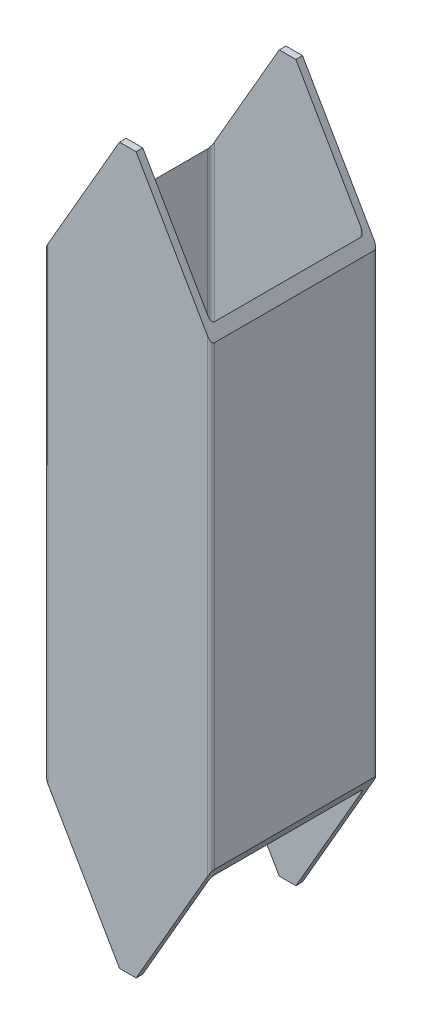
ISO-10303-21;
HEADER;
FILE_DESCRIPTION(('STEP AP214'),'2;1');
FILE_NAME('part.step','',(''),(''),'','','');
FILE_SCHEMA(('AUTOMOTIVE_DESIGN { 1 0 10303 214 1 1 1 1 }'));
ENDSEC;
DATA;
#1=APPLICATION_CONTEXT('core data for automotive mechanical design processes');
#2=APPLICATION_PROTOCOL_DEFINITION('international standard','automotive_design',2000,#1);
#3=PRODUCT_CONTEXT('',#1,'mechanical');
#4=PRODUCT('Part','Part','',(#3));
#5=PRODUCT_RELATED_PRODUCT_CATEGORY('part','',(#4));
#6=PRODUCT_DEFINITION_FORMATION('','',#4);
#7=PRODUCT_DEFINITION_CONTEXT('part definition',#1,'design');
#8=PRODUCT_DEFINITION('design','',#6,#7);
#9=PRODUCT_DEFINITION_SHAPE('','',#8);
#10=(LENGTH_UNIT() NAMED_UNIT(*) SI_UNIT(.MILLI.,.METRE.));
#11=(NAMED_UNIT(*) PLANE_ANGLE_UNIT() SI_UNIT($,.RADIAN.));
#12=(NAMED_UNIT(*) SI_UNIT($,.STERADIAN.) SOLID_ANGLE_UNIT());
#13=UNCERTAINTY_MEASURE_WITH_UNIT(LENGTH_MEASURE(1.E-05),#10,'distance_accuracy_value','');
#14=(GEOMETRIC_REPRESENTATION_CONTEXT(3) GLOBAL_UNCERTAINTY_ASSIGNED_CONTEXT((#13)) GLOBAL_UNIT_ASSIGNED_CONTEXT((#10,
#11,#12)) REPRESENTATION_CONTEXT('',''));
#15=CARTESIAN_POINT('',(0.,0.,0.));
#16=DIRECTION('',(0.,0.,1.));
#17=DIRECTION('',(1.,0.,0.));
#18=AXIS2_PLACEMENT_3D('',#15,#16,#17);
#19=CARTESIAN_POINT('',(2.,430.,-2.));
#20=DIRECTION('',(0.,1.,0.));
#21=DIRECTION('',(0.,0.,1.));
#22=AXIS2_PLACEMENT_3D('',#19,#20,#21);
#23=PLANE('',#22);
#24=DIRECTION('',(0.,0.,1.));
#25=VECTOR('',#24,1.);
#26=CARTESIAN_POINT('',(55.,430.,-100.));
#27=LINE('',#26,#25);
#28=CARTESIAN_POINT('',(55.,430.,-100.));
#29=VERTEX_POINT('',#28);
#30=CARTESIAN_POINT('',(55.,430.,-96.));
#31=VERTEX_POINT('',#30);
#32=EDGE_CURVE('E49',#29,#31,#27,.T.);
#33=ORIENTED_EDGE('',*,*,#32,.F.);
#34=DIRECTION('',(-1.,0.,0.));
#35=VECTOR('',#34,1.);
#36=CARTESIAN_POINT('',(2.00000000000001,430.,-100.));
#37=LINE('',#36,#35);
#38=CARTESIAN_POINT('',(45.,430.,-100.));
#39=VERTEX_POINT('',#38);
#40=EDGE_CURVE('E206',#29,#39,#37,.T.);
#41=ORIENTED_EDGE('',*,*,#40,.T.);
#42=DIRECTION('',(0.,0.,1.));
#43=VECTOR('',#42,1.);
#44=CARTESIAN_POINT('',(45.,430.,-100.));
#45=LINE('',#44,#43);
#46=CARTESIAN_POINT('',(45.,430.,-96.));
#47=VERTEX_POINT('',#46);
#48=EDGE_CURVE('E351',#39,#47,#45,.T.);
#49=ORIENTED_EDGE('',*,*,#48,.T.);
#50=DIRECTION('',(-1.,0.,0.));
#51=VECTOR('',#50,1.);
#52=CARTESIAN_POINT('',(6.00000000000001,430.,-96.));
#53=LINE('',#52,#51);
#54=EDGE_CURVE('E208',#31,#47,#53,.T.);
#55=ORIENTED_EDGE('',*,*,#54,.F.);
#56=EDGE_LOOP('',(#33,#41,#49,#55));
#57=FACE_BOUND('',#56,.T.);
#58=ADVANCED_FACE('F35',(#57),#23,.T.);
#59=CARTESIAN_POINT('',(2.,0.,-2.));
#60=DIRECTION('',(0.,1.,0.));
#61=DIRECTION('',(0.,0.,1.));
#62=AXIS2_PLACEMENT_3D('',#59,#60,#61);
#63=PLANE('',#62);
#64=DIRECTION('',(1.,0.,0.));
#65=VECTOR('',#64,1.);
#66=CARTESIAN_POINT('',(2.00000000000001,0.,0.));
#67=LINE('',#66,#65);
#68=CARTESIAN_POINT('',(45.,0.,0.));
#69=VERTEX_POINT('',#68);
#70=CARTESIAN_POINT('',(55.,0.,0.));
#71=VERTEX_POINT('',#70);
#72=EDGE_CURVE('E227',#69,#71,#67,.T.);
#73=ORIENTED_EDGE('',*,*,#72,.F.);
#74=DIRECTION('',(0.,0.,1.));
#75=VECTOR('',#74,1.);
#76=CARTESIAN_POINT('',(45.,0.,-100.));
#77=LINE('',#76,#75);
#78=CARTESIAN_POINT('',(45.,0.,-4.));
#79=VERTEX_POINT('',#78);
#80=EDGE_CURVE('E406',#79,#69,#77,.T.);
#81=ORIENTED_EDGE('',*,*,#80,.F.);
#82=DIRECTION('',(1.,0.,0.));
#83=VECTOR('',#82,1.);
#84=CARTESIAN_POINT('',(6.00000000000001,0.,-4.));
#85=LINE('',#84,#83);
#86=CARTESIAN_POINT('',(55.,0.,-4.));
#87=VERTEX_POINT('',#86);
#88=EDGE_CURVE('E367',#79,#87,#85,.T.);
#89=ORIENTED_EDGE('',*,*,#88,.T.);
#90=DIRECTION('',(0.,0.,1.));
#91=VECTOR('',#90,1.);
#92=CARTESIAN_POINT('',(55.,0.,-100.));
#93=LINE('',#92,#91);
#94=EDGE_CURVE('E327',#87,#71,#93,.T.);
#95=ORIENTED_EDGE('',*,*,#94,.T.);
#96=EDGE_LOOP('',(#73,#81,#89,#95));
#97=FACE_BOUND('',#96,.T.);
#98=ADVANCED_FACE('F418',(#97),#63,.F.);
#99=CARTESIAN_POINT('',(55.,430.,-4.));
#100=VERTEX_POINT('',#99);
#101=CARTESIAN_POINT('',(55.,430.,0.));
#102=VERTEX_POINT('',#101);
#103=EDGE_CURVE('E210',#100,#102,#27,.T.);
#104=ORIENTED_EDGE('',*,*,#103,.F.);
#105=DIRECTION('',(1.,0.,0.));
#106=VECTOR('',#105,1.);
#107=CARTESIAN_POINT('',(6.00000000000001,430.,-4.));
#108=LINE('',#107,#106);
#109=CARTESIAN_POINT('',(45.,430.,-4.));
#110=VERTEX_POINT('',#109);
#111=EDGE_CURVE('E276',#110,#100,#108,.T.);
#112=ORIENTED_EDGE('',*,*,#111,.F.);
#113=CARTESIAN_POINT('',(45.,430.,0.));
#114=VERTEX_POINT('',#113);
#115=EDGE_CURVE('E354',#110,#114,#45,.T.);
#116=ORIENTED_EDGE('',*,*,#115,.T.);
#117=DIRECTION('',(1.,0.,0.));
#118=VECTOR('',#117,1.);
#119=CARTESIAN_POINT('',(2.00000000000001,430.,0.));
#120=LINE('',#119,#118);
#121=EDGE_CURVE('E217',#114,#102,#120,.T.);
#122=ORIENTED_EDGE('',*,*,#121,.T.);
#123=EDGE_LOOP('',(#104,#112,#116,#122));
#124=FACE_BOUND('',#123,.T.);
#125=ADVANCED_FACE('F436',(#124),#23,.T.);
#126=DIRECTION('',(-1.,0.,0.));
#127=VECTOR('',#126,1.);
#128=CARTESIAN_POINT('',(6.00000000000001,0.,-96.));
#129=LINE('',#128,#127);
#130=CARTESIAN_POINT('',(55.,0.,-96.));
#131=VERTEX_POINT('',#130);
#132=CARTESIAN_POINT('',(45.0000000000001,0.,-96.));
#133=VERTEX_POINT('',#132);
#134=EDGE_CURVE('E279',#131,#133,#129,.T.);
#135=ORIENTED_EDGE('',*,*,#134,.T.);
#136=CARTESIAN_POINT('',(45.,0.,-100.));
#137=VERTEX_POINT('',#136);
#138=EDGE_CURVE('E57',#137,#133,#77,.T.);
#139=ORIENTED_EDGE('',*,*,#138,.F.);
#140=DIRECTION('',(-1.,0.,0.));
#141=VECTOR('',#140,1.);
#142=CARTESIAN_POINT('',(2.00000000000001,0.,-100.));
#143=LINE('',#142,#141);
#144=CARTESIAN_POINT('',(55.,0.,-100.));
#145=VERTEX_POINT('',#144);
#146=EDGE_CURVE('E223',#145,#137,#143,.T.);
#147=ORIENTED_EDGE('',*,*,#146,.F.);
#148=EDGE_CURVE('E323',#145,#131,#93,.T.);
#149=ORIENTED_EDGE('',*,*,#148,.T.);
#150=EDGE_LOOP('',(#135,#139,#147,#149));
#151=FACE_BOUND('',#150,.T.);
#152=ADVANCED_FACE('F375',(#151),#63,.F.);
#153=CARTESIAN_POINT('',(2.,430.,-2.));
#154=DIRECTION('',(0.,-1.,0.));
#155=DIRECTION('',(0.,0.,-1.));
#156=AXIS2_PLACEMENT_3D('',#153,#154,#155);
#157=CYLINDRICAL_SURFACE('',#156,2.);
#158=DIRECTION('',(0.,-1.,0.));
#159=VECTOR('',#158,1.);
#160=CARTESIAN_POINT('',(0.,430.,-2.00000000000001));
#161=LINE('',#160,#159);
#162=CARTESIAN_POINT('',(0.,352.0577136594,-2.00000000000002));
#163=VERTEX_POINT('',#162);
#164=CARTESIAN_POINT('',(0.,77.9422863405987,-2.00000000000002));
#165=VERTEX_POINT('',#164);
#166=EDGE_CURVE('E216',#163,#165,#161,.T.);
#167=ORIENTED_EDGE('',*,*,#166,.T.);
#168=CARTESIAN_POINT('',(2.,74.478184725461,-2.));
#169=DIRECTION('',(0.866025403784436,0.500000000000004,0.));
#170=DIRECTION('',(0.500000000000004,-0.866025403784437,0.));
#171=AXIS2_PLACEMENT_3D('',#168,#169,#170);
#172=ELLIPSE('',#171,3.99999999999997,2.);
#173=CARTESIAN_POINT('',(2.00000000000002,74.4781847254609,0.));
#174=VERTEX_POINT('',#173);
#175=EDGE_CURVE('E313',#165,#174,#172,.T.);
#176=ORIENTED_EDGE('',*,*,#175,.T.);
#177=DIRECTION('',(0.,-1.,0.));
#178=VECTOR('',#177,1.);
#179=CARTESIAN_POINT('',(2.00000000000001,430.,0.));
#180=LINE('',#179,#178);
#181=CARTESIAN_POINT('',(2.00000000000002,355.521815274538,0.));
#182=VERTEX_POINT('',#181);
#183=EDGE_CURVE('E245',#182,#174,#180,.T.);
#184=ORIENTED_EDGE('',*,*,#183,.F.);
#185=CARTESIAN_POINT('',(2.,355.521815274538,-2.));
#186=DIRECTION('',(0.86602540378444,-0.499999999999998,0.));
#187=DIRECTION('',(-0.499999999999998,-0.86602540378444,0.));
#188=AXIS2_PLACEMENT_3D('',#185,#186,#187);
#189=ELLIPSE('',#188,4.00000000000002,2.);
#190=EDGE_CURVE('E364',#182,#163,#189,.T.);
#191=ORIENTED_EDGE('',*,*,#190,.T.);
#192=EDGE_LOOP('',(#167,#176,#184,#191));
#193=FACE_BOUND('',#192,.T.);
#194=ADVANCED_FACE('F37',(#193),#157,.T.);
#195=CARTESIAN_POINT('',(2.00000000000001,430.,0.));
#196=DIRECTION('',(0.,0.,-1.));
#197=DIRECTION('',(-1.,0.,0.));
#198=AXIS2_PLACEMENT_3D('',#195,#196,#197);
#199=PLANE('',#198);
#200=DIRECTION('',(0.,-1.,0.));
#201=VECTOR('',#200,1.);
#202=CARTESIAN_POINT('',(98.,430.,0.));
#203=LINE('',#202,#201);
#204=CARTESIAN_POINT('',(98.,355.521815274538,0.));
#205=VERTEX_POINT('',#204);
#206=CARTESIAN_POINT('',(98.,74.478184725461,0.));
#207=VERTEX_POINT('',#206);
#208=EDGE_CURVE('E243',#205,#207,#203,.T.);
#209=ORIENTED_EDGE('',*,*,#208,.F.);
#210=DIRECTION('',(0.499999999999998,-0.86602540378444,0.));
#211=VECTOR('',#210,1.);
#212=CARTESIAN_POINT('',(55.,430.,0.));
#213=LINE('',#212,#211);
#214=EDGE_CURVE('E201',#102,#205,#213,.T.);
#215=ORIENTED_EDGE('',*,*,#214,.F.);
#216=ORIENTED_EDGE('',*,*,#121,.F.);
#217=DIRECTION('',(0.499999999999998,0.86602540378444,0.));
#218=VECTOR('',#217,1.);
#219=CARTESIAN_POINT('',(45.,430.,0.));
#220=LINE('',#219,#218);
#221=EDGE_CURVE('E347',#182,#114,#220,.T.);
#222=ORIENTED_EDGE('',*,*,#221,.F.);
#223=ORIENTED_EDGE('',*,*,#183,.T.);
#224=DIRECTION('',(-0.500000000000004,0.866025403784436,0.));
#225=VECTOR('',#224,1.);
#226=CARTESIAN_POINT('',(45.,0.,0.));
#227=LINE('',#226,#225);
#228=EDGE_CURVE('E402',#69,#174,#227,.T.);
#229=ORIENTED_EDGE('',*,*,#228,.F.);
#230=ORIENTED_EDGE('',*,*,#72,.T.);
#231=DIRECTION('',(-0.500000000000003,-0.866025403784437,0.));
#232=VECTOR('',#231,1.);
#233=CARTESIAN_POINT('',(55.,0.,0.));
#234=LINE('',#233,#232);
#235=EDGE_CURVE('E316',#207,#71,#234,.T.);
#236=ORIENTED_EDGE('',*,*,#235,.F.);
#237=EDGE_LOOP('',(#209,#215,#216,#222,#223,#229,#230,#236));
#238=FACE_BOUND('',#237,.T.);
#239=ADVANCED_FACE('F414',(#238),#199,.F.);
#240=CARTESIAN_POINT('',(98.,430.,-2.));
#241=DIRECTION('',(0.,-1.,0.));
#242=DIRECTION('',(0.,0.,-1.));
#243=AXIS2_PLACEMENT_3D('',#240,#241,#242);
#244=CYLINDRICAL_SURFACE('',#243,2.);
#245=DIRECTION('',(0.,-1.,0.));
#246=VECTOR('',#245,1.);
#247=CARTESIAN_POINT('',(100.,430.,-2.00000000000001));
#248=LINE('',#247,#246);
#249=CARTESIAN_POINT('',(100.,352.0577136594,-2.00000000000002));
#250=VERTEX_POINT('',#249);
#251=CARTESIAN_POINT('',(100.,77.9422863405988,-2.00000000000002));
#252=VERTEX_POINT('',#251);
#253=EDGE_CURVE('E241',#250,#252,#248,.T.);
#254=ORIENTED_EDGE('',*,*,#253,.F.);
#255=CARTESIAN_POINT('',(98.,355.521815274538,-2.));
#256=DIRECTION('',(-0.86602540378444,-0.499999999999998,0.));
#257=DIRECTION('',(0.499999999999998,-0.86602540378444,0.));
#258=AXIS2_PLACEMENT_3D('',#255,#256,#257);
#259=ELLIPSE('',#258,4.00000000000002,2.);
#260=EDGE_CURVE('E399',#250,#205,#259,.T.);
#261=ORIENTED_EDGE('',*,*,#260,.T.);
#262=ORIENTED_EDGE('',*,*,#208,.T.);
#263=CARTESIAN_POINT('',(98.,74.4781847254611,-2.));
#264=DIRECTION('',(-0.866025403784437,0.500000000000003,0.));
#265=DIRECTION('',(-0.500000000000003,-0.866025403784437,0.));
#266=AXIS2_PLACEMENT_3D('',#263,#264,#265);
#267=ELLIPSE('',#266,3.99999999999997,2.);
#268=EDGE_CURVE('E344',#207,#252,#267,.T.);
#269=ORIENTED_EDGE('',*,*,#268,.T.);
#270=EDGE_LOOP('',(#254,#261,#262,#269));
#271=FACE_BOUND('',#270,.T.);
#272=ADVANCED_FACE('F446',(#271),#244,.T.);
#273=CARTESIAN_POINT('',(100.,430.,-2.00000000000001));
#274=DIRECTION('',(-1.,0.,0.));
#275=DIRECTION('',(0.,0.,1.));
#276=AXIS2_PLACEMENT_3D('',#273,#274,#275);
#277=PLANE('',#276);
#278=DIRECTION('',(0.,-1.,0.));
#279=VECTOR('',#278,1.);
#280=CARTESIAN_POINT('',(100.,430.,-98.));
#281=LINE('',#280,#279);
#282=CARTESIAN_POINT('',(100.,352.0577136594,-98.));
#283=VERTEX_POINT('',#282);
#284=CARTESIAN_POINT('',(100.,77.9422863405988,-98.));
#285=VERTEX_POINT('',#284);
#286=EDGE_CURVE('E239',#283,#285,#281,.T.);
#287=ORIENTED_EDGE('',*,*,#286,.F.);
#288=DIRECTION('',(0.,0.,1.));
#289=VECTOR('',#288,1.);
#290=CARTESIAN_POINT('',(100.,352.0577136594,-100.));
#291=LINE('',#290,#289);
#292=EDGE_CURVE('E200',#283,#250,#291,.T.);
#293=ORIENTED_EDGE('',*,*,#292,.T.);
#294=ORIENTED_EDGE('',*,*,#253,.T.);
#295=DIRECTION('',(0.,0.,1.));
#296=VECTOR('',#295,1.);
#297=CARTESIAN_POINT('',(100.,77.9422863405988,-100.));
#298=LINE('',#297,#296);
#299=EDGE_CURVE('E320',#285,#252,#298,.T.);
#300=ORIENTED_EDGE('',*,*,#299,.F.);
#301=EDGE_LOOP('',(#287,#293,#294,#300));
#302=FACE_BOUND('',#301,.T.);
#303=ADVANCED_FACE('F450',(#302),#277,.F.);
#304=CARTESIAN_POINT('',(98.,430.,-98.));
#305=DIRECTION('',(0.,-1.,0.));
#306=DIRECTION('',(0.,0.,-1.));
#307=AXIS2_PLACEMENT_3D('',#304,#305,#306);
#308=CYLINDRICAL_SURFACE('',#307,2.);
#309=DIRECTION('',(0.,-1.,0.));
#310=VECTOR('',#309,1.);
#311=CARTESIAN_POINT('',(98.,430.,-100.));
#312=LINE('',#311,#310);
#313=CARTESIAN_POINT('',(98.,355.521815274538,-100.));
#314=VERTEX_POINT('',#313);
#315=CARTESIAN_POINT('',(98.,74.478184725461,-100.));
#316=VERTEX_POINT('',#315);
#317=EDGE_CURVE('E237',#314,#316,#312,.T.);
#318=ORIENTED_EDGE('',*,*,#317,.F.);
#319=CARTESIAN_POINT('',(98.,355.521815274538,-98.));
#320=DIRECTION('',(-0.86602540378444,-0.499999999999998,0.));
#321=DIRECTION('',(0.499999999999998,-0.86602540378444,0.));
#322=AXIS2_PLACEMENT_3D('',#319,#320,#321);
#323=ELLIPSE('',#322,4.00000000000002,2.);
#324=EDGE_CURVE('E196',#314,#283,#323,.T.);
#325=ORIENTED_EDGE('',*,*,#324,.T.);
#326=ORIENTED_EDGE('',*,*,#286,.T.);
#327=CARTESIAN_POINT('',(98.,74.4781847254611,-98.));
#328=DIRECTION('',(-0.866025403784437,0.500000000000003,0.));
#329=DIRECTION('',(-0.500000000000003,-0.866025403784437,0.));
#330=AXIS2_PLACEMENT_3D('',#327,#328,#329);
#331=ELLIPSE('',#330,3.99999999999998,2.);
#332=EDGE_CURVE('E341',#285,#316,#331,.T.);
#333=ORIENTED_EDGE('',*,*,#332,.T.);
#334=EDGE_LOOP('',(#318,#325,#326,#333));
#335=FACE_BOUND('',#334,.T.);
#336=ADVANCED_FACE('F453',(#335),#308,.T.);
#337=CARTESIAN_POINT('',(2.00000000000001,430.,-100.));
#338=DIRECTION('',(0.,0.,1.));
#339=DIRECTION('',(1.,0.,0.));
#340=AXIS2_PLACEMENT_3D('',#337,#338,#339);
#341=PLANE('',#340);
#342=ORIENTED_EDGE('',*,*,#40,.F.);
#343=DIRECTION('',(0.499999999999998,-0.86602540378444,0.));
#344=VECTOR('',#343,1.);
#345=CARTESIAN_POINT('',(55.,430.,-100.));
#346=LINE('',#345,#344);
#347=EDGE_CURVE('E193',#29,#314,#346,.T.);
#348=ORIENTED_EDGE('',*,*,#347,.T.);
#349=ORIENTED_EDGE('',*,*,#317,.T.);
#350=DIRECTION('',(-0.500000000000003,-0.866025403784437,0.));
#351=VECTOR('',#350,1.);
#352=CARTESIAN_POINT('',(55.,0.,-100.));
#353=LINE('',#352,#351);
#354=EDGE_CURVE('E317',#316,#145,#353,.T.);
#355=ORIENTED_EDGE('',*,*,#354,.T.);
#356=ORIENTED_EDGE('',*,*,#146,.T.);
#357=DIRECTION('',(-0.500000000000004,0.866025403784436,0.));
#358=VECTOR('',#357,1.);
#359=CARTESIAN_POINT('',(45.,0.,-100.));
#360=LINE('',#359,#358);
#361=CARTESIAN_POINT('',(1.99999999999998,74.478184725461,-100.));
#362=VERTEX_POINT('',#361);
#363=EDGE_CURVE('E403',#137,#362,#360,.T.);
#364=ORIENTED_EDGE('',*,*,#363,.T.);
#365=DIRECTION('',(0.,-1.,0.));
#366=VECTOR('',#365,1.);
#367=CARTESIAN_POINT('',(2.00000000000001,430.,-100.));
#368=LINE('',#367,#366);
#369=CARTESIAN_POINT('',(2.,355.521815274538,-100.));
#370=VERTEX_POINT('',#369);
#371=EDGE_CURVE('E234',#370,#362,#368,.T.);
#372=ORIENTED_EDGE('',*,*,#371,.F.);
#373=DIRECTION('',(0.499999999999998,0.86602540378444,0.));
#374=VECTOR('',#373,1.);
#375=CARTESIAN_POINT('',(45.,430.,-100.));
#376=LINE('',#375,#374);
#377=EDGE_CURVE('E215',#370,#39,#376,.T.);
#378=ORIENTED_EDGE('',*,*,#377,.T.);
#379=EDGE_LOOP('',(#342,#348,#349,#355,#356,#364,#372,#378));
#380=FACE_BOUND('',#379,.T.);
#381=ADVANCED_FACE('F213',(#380),#341,.F.);
#382=CARTESIAN_POINT('',(2.,430.,-98.));
#383=DIRECTION('',(0.,-1.,0.));
#384=DIRECTION('',(0.,0.,-1.));
#385=AXIS2_PLACEMENT_3D('',#382,#383,#384);
#386=CYLINDRICAL_SURFACE('',#385,2.);
#387=ORIENTED_EDGE('',*,*,#371,.T.);
#388=CARTESIAN_POINT('',(2.,74.478184725461,-98.));
#389=DIRECTION('',(0.866025403784436,0.500000000000004,0.));
#390=DIRECTION('',(0.500000000000004,-0.866025403784437,0.));
#391=AXIS2_PLACEMENT_3D('',#388,#389,#390);
#392=ELLIPSE('',#391,3.99999999999997,2.);
#393=CARTESIAN_POINT('',(0.,77.9422863405987,-98.));
#394=VERTEX_POINT('',#393);
#395=EDGE_CURVE('E307',#362,#394,#392,.T.);
#396=ORIENTED_EDGE('',*,*,#395,.T.);
#397=DIRECTION('',(0.,-1.,0.));
#398=VECTOR('',#397,1.);
#399=CARTESIAN_POINT('',(0.,430.,-98.));
#400=LINE('',#399,#398);
#401=CARTESIAN_POINT('',(0.,352.0577136594,-98.));
#402=VERTEX_POINT('',#401);
#403=EDGE_CURVE('E220',#402,#394,#400,.T.);
#404=ORIENTED_EDGE('',*,*,#403,.F.);
#405=CARTESIAN_POINT('',(2.,355.521815274538,-98.));
#406=DIRECTION('',(0.86602540378444,-0.499999999999998,0.));
#407=DIRECTION('',(-0.499999999999998,-0.86602540378444,0.));
#408=AXIS2_PLACEMENT_3D('',#405,#406,#407);
#409=ELLIPSE('',#408,4.00000000000002,2.);
#410=EDGE_CURVE('E361',#402,#370,#409,.T.);
#411=ORIENTED_EDGE('',*,*,#410,.T.);
#412=EDGE_LOOP('',(#387,#396,#404,#411));
#413=FACE_BOUND('',#412,.T.);
#414=ADVANCED_FACE('F455',(#413),#386,.T.);
#415=CARTESIAN_POINT('',(0.,430.,-2.00000000000001));
#416=DIRECTION('',(1.,0.,0.));
#417=DIRECTION('',(0.,0.,-1.));
#418=AXIS2_PLACEMENT_3D('',#415,#416,#417);
#419=PLANE('',#418);
#420=ORIENTED_EDGE('',*,*,#403,.T.);
#421=DIRECTION('',(0.,0.,1.));
#422=VECTOR('',#421,1.);
#423=CARTESIAN_POINT('',(0.,77.9422863405987,-100.));
#424=LINE('',#423,#422);
#425=EDGE_CURVE('E268',#394,#165,#424,.T.);
#426=ORIENTED_EDGE('',*,*,#425,.T.);
#427=ORIENTED_EDGE('',*,*,#166,.F.);
#428=DIRECTION('',(0.,0.,1.));
#429=VECTOR('',#428,1.);
#430=CARTESIAN_POINT('',(0.,352.0577136594,-100.));
#431=LINE('',#430,#429);
#432=EDGE_CURVE('E349',#402,#163,#431,.T.);
#433=ORIENTED_EDGE('',*,*,#432,.F.);
#434=EDGE_LOOP('',(#420,#426,#427,#433));
#435=FACE_BOUND('',#434,.T.);
#436=ADVANCED_FACE('F460',(#435),#419,.F.);
#437=CARTESIAN_POINT('',(6.,430.,-94.));
#438=DIRECTION('',(0.,-1.,0.));
#439=DIRECTION('',(0.,0.,-1.));
#440=AXIS2_PLACEMENT_3D('',#437,#438,#439);
#441=CYLINDRICAL_SURFACE('',#440,2.);
#442=CARTESIAN_POINT('',(6.,67.5499814951855,-94.));
#443=DIRECTION('',(0.866025403784436,0.500000000000004,0.));
#444=DIRECTION('',(0.500000000000004,-0.866025403784437,0.));
#445=AXIS2_PLACEMENT_3D('',#442,#443,#444);
#446=ELLIPSE('',#445,3.99999999999997,2.);
#447=CARTESIAN_POINT('',(6.00000000000001,67.5499814951855,-96.));
#448=VERTEX_POINT('',#447);
#449=CARTESIAN_POINT('',(4.,71.0140831103233,-94.));
#450=VERTEX_POINT('',#449);
#451=EDGE_CURVE('E254',#448,#450,#446,.T.);
#452=ORIENTED_EDGE('',*,*,#451,.F.);
#453=DIRECTION('',(0.,-1.,0.));
#454=VECTOR('',#453,1.);
#455=CARTESIAN_POINT('',(6.00000000000001,430.,-96.));
#456=LINE('',#455,#454);
#457=CARTESIAN_POINT('',(6.00000000000001,362.450018504813,-96.));
#458=VERTEX_POINT('',#457);
#459=EDGE_CURVE('E265',#458,#448,#456,.T.);
#460=ORIENTED_EDGE('',*,*,#459,.F.);
#461=CARTESIAN_POINT('',(6.,362.450018504813,-94.));
#462=DIRECTION('',(0.86602540378444,-0.499999999999998,0.));
#463=DIRECTION('',(-0.499999999999998,-0.86602540378444,0.));
#464=AXIS2_PLACEMENT_3D('',#461,#462,#463);
#465=ELLIPSE('',#464,4.00000000000002,2.);
#466=CARTESIAN_POINT('',(4.,358.985916889676,-94.));
#467=VERTEX_POINT('',#466);
#468=EDGE_CURVE('E353',#467,#458,#465,.T.);
#469=ORIENTED_EDGE('',*,*,#468,.F.);
#470=DIRECTION('',(0.,-1.,0.));
#471=VECTOR('',#470,1.);
#472=CARTESIAN_POINT('',(4.,430.,-94.));
#473=LINE('',#472,#471);
#474=EDGE_CURVE('E229',#467,#450,#473,.T.);
#475=ORIENTED_EDGE('',*,*,#474,.T.);
#476=EDGE_LOOP('',(#452,#460,#469,#475));
#477=FACE_BOUND('',#476,.T.);
#478=ADVANCED_FACE('F263',(#477),#441,.F.);
#479=CARTESIAN_POINT('',(4.,430.,-6.00000000000001));
#480=DIRECTION('',(1.,0.,0.));
#481=DIRECTION('',(0.,0.,-1.));
#482=AXIS2_PLACEMENT_3D('',#479,#480,#481);
#483=PLANE('',#482);
#484=DIRECTION('',(0.,0.,1.));
#485=VECTOR('',#484,1.);
#486=CARTESIAN_POINT('',(4.,71.0140831103233,-6.00000000000001));
#487=LINE('',#486,#485);
#488=CARTESIAN_POINT('',(4.,71.0140831103233,-6.00000000000001));
#489=VERTEX_POINT('',#488);
#490=EDGE_CURVE('E267',#450,#489,#487,.T.);
#491=ORIENTED_EDGE('',*,*,#490,.F.);
#492=ORIENTED_EDGE('',*,*,#474,.F.);
#493=DIRECTION('',(0.,0.,-1.));
#494=VECTOR('',#493,1.);
#495=CARTESIAN_POINT('',(4.,358.985916889676,-6.00000000000001));
#496=LINE('',#495,#494);
#497=CARTESIAN_POINT('',(4.,358.985916889676,-6.00000000000001));
#498=VERTEX_POINT('',#497);
#499=EDGE_CURVE('E296',#498,#467,#496,.T.);
#500=ORIENTED_EDGE('',*,*,#499,.F.);
#501=DIRECTION('',(0.,-1.,0.));
#502=VECTOR('',#501,1.);
#503=CARTESIAN_POINT('',(4.,430.,-6.00000000000001));
#504=LINE('',#503,#502);
#505=EDGE_CURVE('E290',#498,#489,#504,.T.);
#506=ORIENTED_EDGE('',*,*,#505,.T.);
#507=EDGE_LOOP('',(#491,#492,#500,#506));
#508=FACE_BOUND('',#507,.T.);
#509=ADVANCED_FACE('F295',(#508),#483,.T.);
#510=CARTESIAN_POINT('',(6.,430.,-6.));
#511=DIRECTION('',(0.,-1.,0.));
#512=DIRECTION('',(0.,0.,-1.));
#513=AXIS2_PLACEMENT_3D('',#510,#511,#512);
#514=CYLINDRICAL_SURFACE('',#513,2.);
#515=CARTESIAN_POINT('',(6.,67.5499814951855,-6.));
#516=DIRECTION('',(0.866025403784436,0.500000000000004,0.));
#517=DIRECTION('',(0.500000000000004,-0.866025403784437,0.));
#518=AXIS2_PLACEMENT_3D('',#515,#516,#517);
#519=ELLIPSE('',#518,3.99999999999997,2.);
#520=CARTESIAN_POINT('',(6.00000000000001,67.5499814951855,-4.));
#521=VERTEX_POINT('',#520);
#522=EDGE_CURVE('E303',#489,#521,#519,.T.);
#523=ORIENTED_EDGE('',*,*,#522,.F.);
#524=ORIENTED_EDGE('',*,*,#505,.F.);
#525=CARTESIAN_POINT('',(6.,362.450018504813,-6.));
#526=DIRECTION('',(0.86602540378444,-0.499999999999998,0.));
#527=DIRECTION('',(-0.499999999999998,-0.86602540378444,0.));
#528=AXIS2_PLACEMENT_3D('',#525,#526,#527);
#529=ELLIPSE('',#528,4.00000000000002,2.);
#530=CARTESIAN_POINT('',(6.00000000000001,362.450018504813,-4.));
#531=VERTEX_POINT('',#530);
#532=EDGE_CURVE('E301',#531,#498,#529,.T.);
#533=ORIENTED_EDGE('',*,*,#532,.F.);
#534=DIRECTION('',(0.,-1.,0.));
#535=VECTOR('',#534,1.);
#536=CARTESIAN_POINT('',(6.00000000000001,430.,-4.));
#537=LINE('',#536,#535);
#538=EDGE_CURVE('E287',#531,#521,#537,.T.);
#539=ORIENTED_EDGE('',*,*,#538,.T.);
#540=EDGE_LOOP('',(#523,#524,#533,#539));
#541=FACE_BOUND('',#540,.T.);
#542=ADVANCED_FACE('F300',(#541),#514,.F.);
#543=CARTESIAN_POINT('',(6.00000000000001,430.,-4.));
#544=DIRECTION('',(0.,0.,-1.));
#545=DIRECTION('',(-1.,0.,0.));
#546=AXIS2_PLACEMENT_3D('',#543,#544,#545);
#547=PLANE('',#546);
#548=DIRECTION('',(-0.499999999999998,0.86602540378444,0.));
#549=VECTOR('',#548,1.);
#550=CARTESIAN_POINT('',(42.7500000000001,451.217622392719,-4.));
#551=LINE('',#550,#549);
#552=CARTESIAN_POINT('',(94.,362.450018504813,-4.));
#553=VERTEX_POINT('',#552);
#554=EDGE_CURVE('E396',#553,#100,#551,.T.);
#555=ORIENTED_EDGE('',*,*,#554,.F.);
#556=DIRECTION('',(0.,-1.,0.));
#557=VECTOR('',#556,1.);
#558=CARTESIAN_POINT('',(94.,430.,-4.));
#559=LINE('',#558,#557);
#560=CARTESIAN_POINT('',(94.,67.5499814951856,-4.));
#561=VERTEX_POINT('',#560);
#562=EDGE_CURVE('E285',#553,#561,#559,.T.);
#563=ORIENTED_EDGE('',*,*,#562,.T.);
#564=DIRECTION('',(0.500000000000003,0.866025403784437,0.));
#565=VECTOR('',#564,1.);
#566=CARTESIAN_POINT('',(228.945461813655,301.28237760728,-4.));
#567=LINE('',#566,#565);
#568=EDGE_CURVE('E338',#87,#561,#567,.T.);
#569=ORIENTED_EDGE('',*,*,#568,.F.);
#570=ORIENTED_EDGE('',*,*,#88,.F.);
#571=DIRECTION('',(0.500000000000004,-0.866025403784437,0.));
#572=VECTOR('',#571,1.);
#573=CARTESIAN_POINT('',(-150.945461813655,339.387495373795,-4.));
#574=LINE('',#573,#572);
#575=EDGE_CURVE('E305',#521,#79,#574,.T.);
#576=ORIENTED_EDGE('',*,*,#575,.F.);
#577=ORIENTED_EDGE('',*,*,#538,.F.);
#578=DIRECTION('',(-0.499999999999998,-0.86602540378444,0.));
#579=VECTOR('',#578,1.);
#580=CARTESIAN_POINT('',(35.2500000000001,413.112504626204,-4.));
#581=LINE('',#580,#579);
#582=EDGE_CURVE('E359',#110,#531,#581,.T.);
#583=ORIENTED_EDGE('',*,*,#582,.F.);
#584=ORIENTED_EDGE('',*,*,#111,.T.);
#585=EDGE_LOOP('',(#555,#563,#569,#570,#576,#577,#583,#584));
#586=FACE_BOUND('',#585,.T.);
#587=ADVANCED_FACE('F424',(#586),#547,.T.);
#588=CARTESIAN_POINT('',(94.,430.,-6.));
#589=DIRECTION('',(0.,-1.,0.));
#590=DIRECTION('',(0.,0.,-1.));
#591=AXIS2_PLACEMENT_3D('',#588,#589,#590);
#592=CYLINDRICAL_SURFACE('',#591,2.);
#593=CARTESIAN_POINT('',(94.,362.450018504813,-6.));
#594=DIRECTION('',(-0.86602540378444,-0.499999999999998,0.));
#595=DIRECTION('',(0.499999999999998,-0.86602540378444,0.));
#596=AXIS2_PLACEMENT_3D('',#593,#594,#595);
#597=ELLIPSE('',#596,4.00000000000002,2.);
#598=CARTESIAN_POINT('',(96.,358.985916889676,-6.00000000000001));
#599=VERTEX_POINT('',#598);
#600=EDGE_CURVE('E391',#599,#553,#597,.T.);
#601=ORIENTED_EDGE('',*,*,#600,.F.);
#602=DIRECTION('',(0.,-1.,0.));
#603=VECTOR('',#602,1.);
#604=CARTESIAN_POINT('',(96.,430.,-6.00000000000001));
#605=LINE('',#604,#603);
#606=CARTESIAN_POINT('',(96.,71.0140831103234,-6.00000000000001));
#607=VERTEX_POINT('',#606);
#608=EDGE_CURVE('E283',#599,#607,#605,.T.);
#609=ORIENTED_EDGE('',*,*,#608,.T.);
#610=CARTESIAN_POINT('',(94.,67.5499814951856,-6.));
#611=DIRECTION('',(-0.866025403784437,0.500000000000003,0.));
#612=DIRECTION('',(-0.500000000000003,-0.866025403784437,0.));
#613=AXIS2_PLACEMENT_3D('',#610,#611,#612);
#614=ELLIPSE('',#613,3.99999999999997,2.);
#615=EDGE_CURVE('E335',#561,#607,#614,.T.);
#616=ORIENTED_EDGE('',*,*,#615,.F.);
#617=ORIENTED_EDGE('',*,*,#562,.F.);
#618=EDGE_LOOP('',(#601,#609,#616,#617));
#619=FACE_BOUND('',#618,.T.);
#620=ADVANCED_FACE('F428',(#619),#592,.F.);
#621=CARTESIAN_POINT('',(96.,430.,-6.00000000000001));
#622=DIRECTION('',(-1.,0.,0.));
#623=DIRECTION('',(0.,0.,1.));
#624=AXIS2_PLACEMENT_3D('',#621,#622,#623);
#625=PLANE('',#624);
#626=DIRECTION('',(0.,0.,1.));
#627=VECTOR('',#626,1.);
#628=CARTESIAN_POINT('',(96.,358.985916889676,-6.00000000000001));
#629=LINE('',#628,#627);
#630=CARTESIAN_POINT('',(96.,358.985916889676,-94.));
#631=VERTEX_POINT('',#630);
#632=EDGE_CURVE('E389',#631,#599,#629,.T.);
#633=ORIENTED_EDGE('',*,*,#632,.F.);
#634=DIRECTION('',(0.,-1.,0.));
#635=VECTOR('',#634,1.);
#636=CARTESIAN_POINT('',(96.,430.,-94.));
#637=LINE('',#636,#635);
#638=CARTESIAN_POINT('',(96.,71.0140831103234,-94.));
#639=VERTEX_POINT('',#638);
#640=EDGE_CURVE('E274',#631,#639,#637,.T.);
#641=ORIENTED_EDGE('',*,*,#640,.T.);
#642=DIRECTION('',(0.,0.,-1.));
#643=VECTOR('',#642,1.);
#644=CARTESIAN_POINT('',(96.,71.0140831103234,-6.00000000000001));
#645=LINE('',#644,#643);
#646=EDGE_CURVE('E332',#607,#639,#645,.T.);
#647=ORIENTED_EDGE('',*,*,#646,.F.);
#648=ORIENTED_EDGE('',*,*,#608,.F.);
#649=EDGE_LOOP('',(#633,#641,#647,#648));
#650=FACE_BOUND('',#649,.T.);
#651=ADVANCED_FACE('F431',(#650),#625,.T.);
#652=CARTESIAN_POINT('',(94.,430.,-94.));
#653=DIRECTION('',(0.,-1.,0.));
#654=DIRECTION('',(0.,0.,-1.));
#655=AXIS2_PLACEMENT_3D('',#652,#653,#654);
#656=CYLINDRICAL_SURFACE('',#655,2.);
#657=CARTESIAN_POINT('',(94.,362.450018504813,-94.));
#658=DIRECTION('',(-0.86602540378444,-0.499999999999998,0.));
#659=DIRECTION('',(0.499999999999998,-0.86602540378444,0.));
#660=AXIS2_PLACEMENT_3D('',#657,#658,#659);
#661=ELLIPSE('',#660,4.00000000000002,2.);
#662=CARTESIAN_POINT('',(94.,362.450018504813,-96.));
#663=VERTEX_POINT('',#662);
#664=EDGE_CURVE('E209',#663,#631,#661,.T.);
#665=ORIENTED_EDGE('',*,*,#664,.F.);
#666=DIRECTION('',(0.,-1.,0.));
#667=VECTOR('',#666,1.);
#668=CARTESIAN_POINT('',(94.,430.,-96.));
#669=LINE('',#668,#667);
#670=CARTESIAN_POINT('',(94.,67.5499814951855,-96.));
#671=VERTEX_POINT('',#670);
#672=EDGE_CURVE('E272',#663,#671,#669,.T.);
#673=ORIENTED_EDGE('',*,*,#672,.T.);
#674=CARTESIAN_POINT('',(94.,67.5499814951856,-94.));
#675=DIRECTION('',(-0.866025403784437,0.500000000000003,0.));
#676=DIRECTION('',(-0.500000000000003,-0.866025403784437,0.));
#677=AXIS2_PLACEMENT_3D('',#674,#675,#676);
#678=ELLIPSE('',#677,3.99999999999998,2.);
#679=EDGE_CURVE('E326',#639,#671,#678,.T.);
#680=ORIENTED_EDGE('',*,*,#679,.F.);
#681=ORIENTED_EDGE('',*,*,#640,.F.);
#682=EDGE_LOOP('',(#665,#673,#680,#681));
#683=FACE_BOUND('',#682,.T.);
#684=ADVANCED_FACE('F387',(#683),#656,.F.);
#685=CARTESIAN_POINT('',(6.00000000000001,430.,-96.));
#686=DIRECTION('',(0.,0.,1.));
#687=DIRECTION('',(1.,0.,0.));
#688=AXIS2_PLACEMENT_3D('',#685,#686,#687);
#689=PLANE('',#688);
#690=DIRECTION('',(0.499999999999998,-0.86602540378444,0.));
#691=VECTOR('',#690,1.);
#692=CARTESIAN_POINT('',(42.7500000000001,451.217622392719,-96.));
#693=LINE('',#692,#691);
#694=EDGE_CURVE('E11',#31,#663,#693,.T.);
#695=ORIENTED_EDGE('',*,*,#694,.F.);
#696=ORIENTED_EDGE('',*,*,#54,.T.);
#697=DIRECTION('',(0.499999999999998,0.86602540378444,0.));
#698=VECTOR('',#697,1.);
#699=CARTESIAN_POINT('',(35.2500000000001,413.112504626204,-96.));
#700=LINE('',#699,#698);
#701=EDGE_CURVE('E248',#458,#47,#700,.T.);
#702=ORIENTED_EDGE('',*,*,#701,.F.);
#703=ORIENTED_EDGE('',*,*,#459,.T.);
#704=DIRECTION('',(-0.500000000000004,0.866025403784437,0.));
#705=VECTOR('',#704,1.);
#706=CARTESIAN_POINT('',(-150.945461813655,339.387495373795,-96.));
#707=LINE('',#706,#705);
#708=EDGE_CURVE('E43',#133,#448,#707,.T.);
#709=ORIENTED_EDGE('',*,*,#708,.F.);
#710=ORIENTED_EDGE('',*,*,#134,.F.);
#711=DIRECTION('',(-0.500000000000003,-0.866025403784437,0.));
#712=VECTOR('',#711,1.);
#713=CARTESIAN_POINT('',(228.945461813655,301.28237760728,-96.));
#714=LINE('',#713,#712);
#715=EDGE_CURVE('E251',#671,#131,#714,.T.);
#716=ORIENTED_EDGE('',*,*,#715,.F.);
#717=ORIENTED_EDGE('',*,*,#672,.F.);
#718=EDGE_LOOP('',(#695,#696,#702,#703,#709,#710,#716,#717));
#719=FACE_BOUND('',#718,.T.);
#720=ADVANCED_FACE('F271',(#719),#689,.T.);
#721=CARTESIAN_POINT('',(45.,430.,-100.));
#722=DIRECTION('',(0.86602540378444,-0.499999999999998,0.));
#723=DIRECTION('',(0.499999999999998,0.86602540378444,0.));
#724=AXIS2_PLACEMENT_3D('',#721,#722,#723);
#725=PLANE('',#724);
#726=ORIENTED_EDGE('',*,*,#221,.T.);
#727=ORIENTED_EDGE('',*,*,#115,.F.);
#728=ORIENTED_EDGE('',*,*,#582,.T.);
#729=ORIENTED_EDGE('',*,*,#532,.T.);
#730=ORIENTED_EDGE('',*,*,#499,.T.);
#731=ORIENTED_EDGE('',*,*,#468,.T.);
#732=ORIENTED_EDGE('',*,*,#701,.T.);
#733=ORIENTED_EDGE('',*,*,#48,.F.);
#734=ORIENTED_EDGE('',*,*,#377,.F.);
#735=ORIENTED_EDGE('',*,*,#410,.F.);
#736=ORIENTED_EDGE('',*,*,#432,.T.);
#737=ORIENTED_EDGE('',*,*,#190,.F.);
#738=EDGE_LOOP('',(#726,#727,#728,#729,#730,#731,#732,#733,#734,#735,#736,#737));
#739=FACE_BOUND('',#738,.T.);
#740=ADVANCED_FACE('F441',(#739),#725,.F.);
#741=CARTESIAN_POINT('',(55.,0.,-100.));
#742=DIRECTION('',(-0.866025403784437,0.500000000000003,0.));
#743=DIRECTION('',(-0.500000000000003,-0.866025403784437,0.));
#744=AXIS2_PLACEMENT_3D('',#741,#742,#743);
#745=PLANE('',#744);
#746=ORIENTED_EDGE('',*,*,#235,.T.);
#747=ORIENTED_EDGE('',*,*,#94,.F.);
#748=ORIENTED_EDGE('',*,*,#568,.T.);
#749=ORIENTED_EDGE('',*,*,#615,.T.);
#750=ORIENTED_EDGE('',*,*,#646,.T.);
#751=ORIENTED_EDGE('',*,*,#679,.T.);
#752=ORIENTED_EDGE('',*,*,#715,.T.);
#753=ORIENTED_EDGE('',*,*,#148,.F.);
#754=ORIENTED_EDGE('',*,*,#354,.F.);
#755=ORIENTED_EDGE('',*,*,#332,.F.);
#756=ORIENTED_EDGE('',*,*,#299,.T.);
#757=ORIENTED_EDGE('',*,*,#268,.F.);
#758=EDGE_LOOP('',(#746,#747,#748,#749,#750,#751,#752,#753,#754,#755,#756,#757));
#759=FACE_BOUND('',#758,.T.);
#760=ADVANCED_FACE('F380',(#759),#745,.F.);
#761=CARTESIAN_POINT('',(45.,0.,-100.));
#762=DIRECTION('',(0.866025403784436,0.500000000000004,0.));
#763=DIRECTION('',(-0.500000000000004,0.866025403784437,0.));
#764=AXIS2_PLACEMENT_3D('',#761,#762,#763);
#765=PLANE('',#764);
#766=ORIENTED_EDGE('',*,*,#425,.F.);
#767=ORIENTED_EDGE('',*,*,#395,.F.);
#768=ORIENTED_EDGE('',*,*,#363,.F.);
#769=ORIENTED_EDGE('',*,*,#138,.T.);
#770=ORIENTED_EDGE('',*,*,#708,.T.);
#771=ORIENTED_EDGE('',*,*,#451,.T.);
#772=ORIENTED_EDGE('',*,*,#490,.T.);
#773=ORIENTED_EDGE('',*,*,#522,.T.);
#774=ORIENTED_EDGE('',*,*,#575,.T.);
#775=ORIENTED_EDGE('',*,*,#80,.T.);
#776=ORIENTED_EDGE('',*,*,#228,.T.);
#777=ORIENTED_EDGE('',*,*,#175,.F.);
#778=EDGE_LOOP('',(#766,#767,#768,#769,#770,#771,#772,#773,#774,#775,#776,#777));
#779=FACE_BOUND('',#778,.T.);
#780=ADVANCED_FACE('F253',(#779),#765,.F.);
#781=CARTESIAN_POINT('',(55.,430.,-100.));
#782=DIRECTION('',(-0.86602540378444,-0.499999999999998,0.));
#783=DIRECTION('',(0.499999999999998,-0.86602540378444,0.));
#784=AXIS2_PLACEMENT_3D('',#781,#782,#783);
#785=PLANE('',#784);
#786=ORIENTED_EDGE('',*,*,#292,.F.);
#787=ORIENTED_EDGE('',*,*,#324,.F.);
#788=ORIENTED_EDGE('',*,*,#347,.F.);
#789=ORIENTED_EDGE('',*,*,#32,.T.);
#790=ORIENTED_EDGE('',*,*,#694,.T.);
#791=ORIENTED_EDGE('',*,*,#664,.T.);
#792=ORIENTED_EDGE('',*,*,#632,.T.);
#793=ORIENTED_EDGE('',*,*,#600,.T.);
#794=ORIENTED_EDGE('',*,*,#554,.T.);
#795=ORIENTED_EDGE('',*,*,#103,.T.);
#796=ORIENTED_EDGE('',*,*,#214,.T.);
#797=ORIENTED_EDGE('',*,*,#260,.F.);
#798=EDGE_LOOP('',(#786,#787,#788,#789,#790,#791,#792,#793,#794,#795,#796,#797));
#799=FACE_BOUND('',#798,.T.);
#800=ADVANCED_FACE('F194',(#799),#785,.F.);
#801=CLOSED_SHELL('',(#58,#98,#125,#152,#194,#239,#272,#303,#336,#381,#414,#436,#478,#509,#542,
#587,#620,#651,#684,#720,#740,#760,#780,#800));
#802=MANIFOLD_SOLID_BREP('B2',#801);
#803=ADVANCED_BREP_SHAPE_REPRESENTATION('',(#18,#802),#14);
#804=SHAPE_DEFINITION_REPRESENTATION(#9,#803);
ENDSEC;
END-ISO-10303-21;
